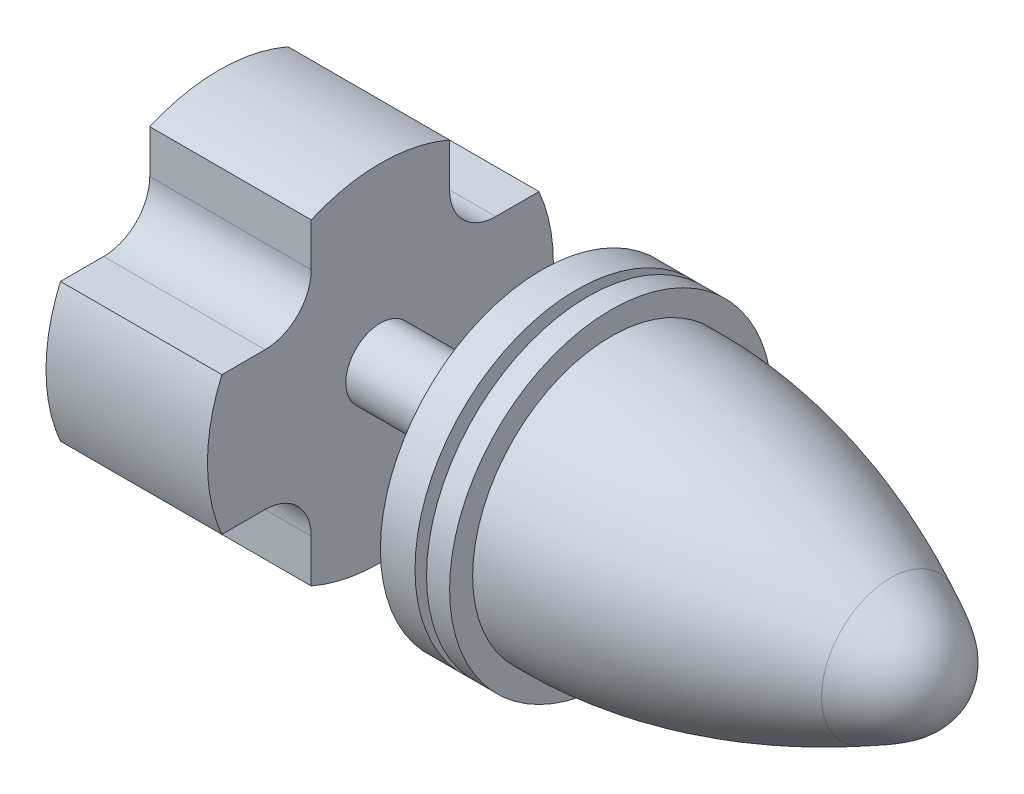
ISO-10303-21;
HEADER;
FILE_DESCRIPTION(('STEP AP214'),'2;1');
FILE_NAME('part.step','',(''),(''),'','','');
FILE_SCHEMA(('AUTOMOTIVE_DESIGN { 1 0 10303 214 1 1 1 1 }'));
ENDSEC;
DATA;
#1=APPLICATION_CONTEXT('core data for automotive mechanical design processes');
#2=APPLICATION_PROTOCOL_DEFINITION('international standard','automotive_design',2000,#1);
#3=PRODUCT_CONTEXT('',#1,'mechanical');
#4=PRODUCT('Part','Part','',(#3));
#5=PRODUCT_RELATED_PRODUCT_CATEGORY('part','',(#4));
#6=PRODUCT_DEFINITION_FORMATION('','',#4);
#7=PRODUCT_DEFINITION_CONTEXT('part definition',#1,'design');
#8=PRODUCT_DEFINITION('design','',#6,#7);
#9=PRODUCT_DEFINITION_SHAPE('','',#8);
#10=(LENGTH_UNIT() NAMED_UNIT(*) SI_UNIT(.MILLI.,.METRE.));
#11=(NAMED_UNIT(*) PLANE_ANGLE_UNIT() SI_UNIT($,.RADIAN.));
#12=(NAMED_UNIT(*) SI_UNIT($,.STERADIAN.) SOLID_ANGLE_UNIT());
#13=UNCERTAINTY_MEASURE_WITH_UNIT(LENGTH_MEASURE(1.E-05),#10,'distance_accuracy_value','');
#14=(GEOMETRIC_REPRESENTATION_CONTEXT(3) GLOBAL_UNCERTAINTY_ASSIGNED_CONTEXT((#13)) GLOBAL_UNIT_ASSIGNED_CONTEXT((#10,
#11,#12)) REPRESENTATION_CONTEXT('',''));
#15=CARTESIAN_POINT('',(0.,0.,0.));
#16=DIRECTION('',(0.,0.,1.));
#17=DIRECTION('',(1.,0.,0.));
#18=AXIS2_PLACEMENT_3D('',#15,#16,#17);
#19=CARTESIAN_POINT('',(0.,0.,0.));
#20=DIRECTION('',(-1.,0.,0.));
#21=DIRECTION('',(0.,0.,1.));
#22=AXIS2_PLACEMENT_3D('',#19,#20,#21);
#23=CYLINDRICAL_SURFACE('',#22,7.5);
#24=DIRECTION('',(-1.,0.,0.));
#25=VECTOR('',#24,1.);
#26=CARTESIAN_POINT('',(43.6678239931224,-2.99999999999993,-6.87386354243379));
#27=LINE('',#26,#25);
#28=CARTESIAN_POINT('',(40.6678239931224,-2.99999999999993,-6.87386354243379));
#29=VERTEX_POINT('',#28);
#30=CARTESIAN_POINT('',(33.6678239931224,-2.99999999999993,-6.87386354243379));
#31=VERTEX_POINT('',#30);
#32=EDGE_CURVE('E174',#29,#31,#27,.T.);
#33=ORIENTED_EDGE('',*,*,#32,.T.);
#34=CARTESIAN_POINT('',(33.6678239931224,0.,0.));
#35=DIRECTION('',(-1.,0.,0.));
#36=DIRECTION('',(0.,0.,1.));
#37=AXIS2_PLACEMENT_3D('',#34,#35,#36);
#38=CIRCLE('',#37,7.5);
#39=CARTESIAN_POINT('',(33.6678239931224,3.,-6.87386354243376));
#40=VERTEX_POINT('',#39);
#41=EDGE_CURVE('E318',#40,#31,#38,.T.);
#42=ORIENTED_EDGE('',*,*,#41,.F.);
#43=DIRECTION('',(-1.,0.,0.));
#44=VECTOR('',#43,1.);
#45=CARTESIAN_POINT('',(43.6678239931224,3.,-6.87386354243376));
#46=LINE('',#45,#44);
#47=CARTESIAN_POINT('',(40.6678239931224,3.,-6.87386354243376));
#48=VERTEX_POINT('',#47);
#49=EDGE_CURVE('E221',#48,#40,#46,.T.);
#50=ORIENTED_EDGE('',*,*,#49,.F.);
#51=CARTESIAN_POINT('',(40.6678239931224,0.,0.));
#52=DIRECTION('',(-1.,0.,0.));
#53=DIRECTION('',(0.,0.,1.));
#54=AXIS2_PLACEMENT_3D('',#51,#52,#53);
#55=CIRCLE('',#54,7.5);
#56=EDGE_CURVE('E320',#48,#29,#55,.T.);
#57=ORIENTED_EDGE('',*,*,#56,.T.);
#58=EDGE_LOOP('',(#33,#42,#50,#57));
#59=FACE_BOUND('',#58,.T.);
#60=ADVANCED_FACE('F33',(#59),#23,.T.);
#61=CARTESIAN_POINT('',(33.6678239931224,-6.87386354243373,-3.00000000000007));
#62=VERTEX_POINT('',#61);
#63=CARTESIAN_POINT('',(33.6678239931224,-6.87386354243378,2.99999999999995));
#64=VERTEX_POINT('',#63);
#65=EDGE_CURVE('E326',#62,#64,#38,.T.);
#66=ORIENTED_EDGE('',*,*,#65,.F.);
#67=DIRECTION('',(-1.,0.,0.));
#68=VECTOR('',#67,1.);
#69=CARTESIAN_POINT('',(43.6678239931224,-6.87386354243373,-3.00000000000007));
#70=LINE('',#69,#68);
#71=CARTESIAN_POINT('',(40.6678239931224,-6.87386354243373,-3.00000000000007));
#72=VERTEX_POINT('',#71);
#73=EDGE_CURVE('E162',#72,#62,#70,.T.);
#74=ORIENTED_EDGE('',*,*,#73,.F.);
#75=CARTESIAN_POINT('',(40.6678239931224,-6.87386354243378,2.99999999999995));
#76=VERTEX_POINT('',#75);
#77=EDGE_CURVE('E337',#72,#76,#55,.T.);
#78=ORIENTED_EDGE('',*,*,#77,.T.);
#79=DIRECTION('',(-1.,0.,0.));
#80=VECTOR('',#79,1.);
#81=CARTESIAN_POINT('',(43.6678239931224,-6.87386354243378,2.99999999999995));
#82=LINE('',#81,#80);
#83=EDGE_CURVE('E189',#76,#64,#82,.T.);
#84=ORIENTED_EDGE('',*,*,#83,.T.);
#85=EDGE_LOOP('',(#66,#74,#78,#84));
#86=FACE_BOUND('',#85,.T.);
#87=ADVANCED_FACE('F309',(#86),#23,.T.);
#88=CARTESIAN_POINT('',(33.6678239931224,-3.00000000000005,6.87386354243374));
#89=VERTEX_POINT('',#88);
#90=CARTESIAN_POINT('',(33.6678239931224,2.99999999999998,6.87386354243377));
#91=VERTEX_POINT('',#90);
#92=EDGE_CURVE('E332',#89,#91,#38,.T.);
#93=ORIENTED_EDGE('',*,*,#92,.F.);
#94=DIRECTION('',(-1.,0.,0.));
#95=VECTOR('',#94,1.);
#96=CARTESIAN_POINT('',(43.6678239931224,-3.00000000000005,6.87386354243374));
#97=LINE('',#96,#95);
#98=CARTESIAN_POINT('',(40.6678239931224,-3.00000000000005,6.87386354243374));
#99=VERTEX_POINT('',#98);
#100=EDGE_CURVE('E186',#99,#89,#97,.T.);
#101=ORIENTED_EDGE('',*,*,#100,.F.);
#102=CARTESIAN_POINT('',(40.6678239931224,2.99999999999998,6.87386354243377));
#103=VERTEX_POINT('',#102);
#104=EDGE_CURVE('E339',#99,#103,#55,.T.);
#105=ORIENTED_EDGE('',*,*,#104,.T.);
#106=DIRECTION('',(-1.,0.,0.));
#107=VECTOR('',#106,1.);
#108=CARTESIAN_POINT('',(43.6678239931224,2.99999999999998,6.87386354243377));
#109=LINE('',#108,#107);
#110=EDGE_CURVE('E206',#103,#91,#109,.T.);
#111=ORIENTED_EDGE('',*,*,#110,.T.);
#112=EDGE_LOOP('',(#93,#101,#105,#111));
#113=FACE_BOUND('',#112,.T.);
#114=ADVANCED_FACE('F293',(#113),#23,.T.);
#115=CARTESIAN_POINT('',(38.6678239931224,0.,0.));
#116=DIRECTION('',(1.,0.,0.));
#117=DIRECTION('',(0.,0.,-1.));
#118=AXIS2_PLACEMENT_3D('',#115,#116,#117);
#119=PLANE('',#118);
#120=CARTESIAN_POINT('',(38.6678239931224,0.,0.));
#121=DIRECTION('',(-1.,0.,0.));
#122=DIRECTION('',(0.,0.,1.));
#123=AXIS2_PLACEMENT_3D('',#120,#121,#122);
#124=CIRCLE('',#123,1.585);
#125=CARTESIAN_POINT('',(38.6678239931224,0.,1.585));
#126=VERTEX_POINT('',#125);
#127=EDGE_CURVE('E469',#126,#126,#124,.T.);
#128=ORIENTED_EDGE('',*,*,#127,.T.);
#129=EDGE_LOOP('',(#128));
#130=FACE_BOUND('',#129,.T.);
#131=ADVANCED_FACE('F35',(#130),#119,.F.);
#132=CARTESIAN_POINT('',(0.,0.,0.));
#133=DIRECTION('',(-1.,0.,0.));
#134=DIRECTION('',(0.,0.,1.));
#135=AXIS2_PLACEMENT_3D('',#132,#133,#134);
#136=CYLINDRICAL_SURFACE('',#135,1.585);
#137=ORIENTED_EDGE('',*,*,#127,.F.);
#138=EDGE_LOOP('',(#137));
#139=FACE_BOUND('',#138,.T.);
#140=CARTESIAN_POINT('',(36.6678239931224,0.,0.));
#141=DIRECTION('',(-1.,0.,0.));
#142=DIRECTION('',(0.,0.,1.));
#143=AXIS2_PLACEMENT_3D('',#140,#141,#142);
#144=CIRCLE('',#143,1.585);
#145=CARTESIAN_POINT('',(36.6678239931224,0.,1.585));
#146=VERTEX_POINT('',#145);
#147=EDGE_CURVE('E330',#146,#146,#144,.T.);
#148=ORIENTED_EDGE('',*,*,#147,.T.);
#149=EDGE_LOOP('',(#148));
#150=FACE_BOUND('',#149,.T.);
#151=ADVANCED_FACE('F298',(#139,#150),#136,.F.);
#152=CARTESIAN_POINT('',(33.6678239931224,0.,0.));
#153=DIRECTION('',(-1.,0.,0.));
#154=DIRECTION('',(0.,0.,1.));
#155=AXIS2_PLACEMENT_3D('',#152,#153,#154);
#156=CONICAL_SURFACE('',#155,4.585,0.785398163397448);
#157=ORIENTED_EDGE('',*,*,#147,.F.);
#158=EDGE_LOOP('',(#157));
#159=FACE_BOUND('',#158,.T.);
#160=CARTESIAN_POINT('',(33.6678239931224,0.,0.));
#161=DIRECTION('',(-1.,0.,0.));
#162=DIRECTION('',(0.,0.,1.));
#163=AXIS2_PLACEMENT_3D('',#160,#161,#162);
#164=CIRCLE('',#163,4.585);
#165=CARTESIAN_POINT('',(33.6678239931224,0.,4.585));
#166=VERTEX_POINT('',#165);
#167=EDGE_CURVE('E325',#166,#166,#164,.T.);
#168=ORIENTED_EDGE('',*,*,#167,.T.);
#169=EDGE_LOOP('',(#168));
#170=FACE_BOUND('',#169,.T.);
#171=ADVANCED_FACE('F296',(#159,#170),#156,.F.);
#172=CARTESIAN_POINT('',(33.6678239931224,4.585,0.));
#173=DIRECTION('',(1.,0.,0.));
#174=DIRECTION('',(0.,0.,-1.));
#175=AXIS2_PLACEMENT_3D('',#172,#173,#174);
#176=PLANE('',#175);
#177=CARTESIAN_POINT('',(33.6678239931224,-4.99999999999995,-5.00000000000005));
#178=DIRECTION('',(-1.,0.,0.));
#179=DIRECTION('',(0.,0.,1.));
#180=AXIS2_PLACEMENT_3D('',#177,#178,#179);
#181=CIRCLE('',#180,2.);
#182=CARTESIAN_POINT('',(33.6678239931224,-4.99999999999998,-3.00000000000005));
#183=VERTEX_POINT('',#182);
#184=CARTESIAN_POINT('',(33.6678239931224,-2.99999999999995,-5.00000000000005));
#185=VERTEX_POINT('',#184);
#186=EDGE_CURVE('E151',#183,#185,#181,.T.);
#187=ORIENTED_EDGE('',*,*,#186,.F.);
#188=DIRECTION('',(0.,1.,0.));
#189=VECTOR('',#188,1.);
#190=CARTESIAN_POINT('',(33.6678239931224,0.,-3.));
#191=LINE('',#190,#189);
#192=EDGE_CURVE('E159',#62,#183,#191,.T.);
#193=ORIENTED_EDGE('',*,*,#192,.F.);
#194=ORIENTED_EDGE('',*,*,#65,.T.);
#195=DIRECTION('',(0.,1.,0.));
#196=VECTOR('',#195,1.);
#197=CARTESIAN_POINT('',(33.6678239931224,0.,3.));
#198=LINE('',#197,#196);
#199=CARTESIAN_POINT('',(33.6678239931224,-5.00000000000004,2.99999999999997));
#200=VERTEX_POINT('',#199);
#201=EDGE_CURVE('E182',#64,#200,#198,.T.);
#202=ORIENTED_EDGE('',*,*,#201,.T.);
#203=CARTESIAN_POINT('',(33.6678239931224,-5.00000000000003,4.99999999999997));
#204=DIRECTION('',(-1.,0.,0.));
#205=DIRECTION('',(0.,0.,1.));
#206=AXIS2_PLACEMENT_3D('',#203,#204,#205);
#207=CIRCLE('',#206,2.);
#208=CARTESIAN_POINT('',(33.6678239931224,-3.00000000000004,4.99999999999999));
#209=VERTEX_POINT('',#208);
#210=EDGE_CURVE('E180',#209,#200,#207,.T.);
#211=ORIENTED_EDGE('',*,*,#210,.F.);
#212=DIRECTION('',(0.,0.,-1.));
#213=VECTOR('',#212,1.);
#214=CARTESIAN_POINT('',(33.6678239931224,-3.,0.));
#215=LINE('',#214,#213);
#216=EDGE_CURVE('E173',#89,#209,#215,.T.);
#217=ORIENTED_EDGE('',*,*,#216,.F.);
#218=ORIENTED_EDGE('',*,*,#92,.T.);
#219=DIRECTION('',(0.,0.,-1.));
#220=VECTOR('',#219,1.);
#221=CARTESIAN_POINT('',(33.6678239931224,3.,0.));
#222=LINE('',#221,#220);
#223=CARTESIAN_POINT('',(33.6678239931224,2.99999999999998,5.00000000000002));
#224=VERTEX_POINT('',#223);
#225=EDGE_CURVE('E199',#91,#224,#222,.T.);
#226=ORIENTED_EDGE('',*,*,#225,.T.);
#227=CARTESIAN_POINT('',(33.6678239931224,4.99999999999998,5.00000000000002));
#228=DIRECTION('',(-1.,0.,0.));
#229=DIRECTION('',(0.,0.,1.));
#230=AXIS2_PLACEMENT_3D('',#227,#228,#229);
#231=CIRCLE('',#230,2.);
#232=CARTESIAN_POINT('',(33.6678239931224,5.,3.00000000000002));
#233=VERTEX_POINT('',#232);
#234=EDGE_CURVE('E196',#233,#224,#231,.T.);
#235=ORIENTED_EDGE('',*,*,#234,.F.);
#236=DIRECTION('',(0.,-1.,0.));
#237=VECTOR('',#236,1.);
#238=CARTESIAN_POINT('',(33.6678239931224,0.,3.));
#239=LINE('',#238,#237);
#240=CARTESIAN_POINT('',(33.6678239931224,6.87386354243375,3.00000000000002));
#241=VERTEX_POINT('',#240);
#242=EDGE_CURVE('E188',#241,#233,#239,.T.);
#243=ORIENTED_EDGE('',*,*,#242,.F.);
#244=CARTESIAN_POINT('',(33.6678239931224,6.87386354243376,-3.));
#245=VERTEX_POINT('',#244);
#246=EDGE_CURVE('E328',#241,#245,#38,.T.);
#247=ORIENTED_EDGE('',*,*,#246,.T.);
#248=DIRECTION('',(0.,-1.,0.));
#249=VECTOR('',#248,1.);
#250=CARTESIAN_POINT('',(33.6678239931224,0.,-3.));
#251=LINE('',#250,#249);
#252=CARTESIAN_POINT('',(33.6678239931224,5.00000000000002,-3.));
#253=VERTEX_POINT('',#252);
#254=EDGE_CURVE('E217',#245,#253,#251,.T.);
#255=ORIENTED_EDGE('',*,*,#254,.T.);
#256=CARTESIAN_POINT('',(33.6678239931224,5.,-5.));
#257=DIRECTION('',(-1.,0.,0.));
#258=DIRECTION('',(0.,0.,1.));
#259=AXIS2_PLACEMENT_3D('',#256,#257,#258);
#260=CIRCLE('',#259,2.);
#261=CARTESIAN_POINT('',(33.6678239931224,3.,-5.00000000000002));
#262=VERTEX_POINT('',#261);
#263=EDGE_CURVE('E214',#262,#253,#260,.T.);
#264=ORIENTED_EDGE('',*,*,#263,.F.);
#265=DIRECTION('',(0.,0.,1.));
#266=VECTOR('',#265,1.);
#267=CARTESIAN_POINT('',(33.6678239931224,3.,0.));
#268=LINE('',#267,#266);
#269=EDGE_CURVE('E205',#40,#262,#268,.T.);
#270=ORIENTED_EDGE('',*,*,#269,.F.);
#271=ORIENTED_EDGE('',*,*,#41,.T.);
#272=DIRECTION('',(0.,0.,1.));
#273=VECTOR('',#272,1.);
#274=CARTESIAN_POINT('',(33.6678239931224,-3.,0.));
#275=LINE('',#274,#273);
#276=EDGE_CURVE('E156',#31,#185,#275,.T.);
#277=ORIENTED_EDGE('',*,*,#276,.T.);
#278=EDGE_LOOP('',(#187,#193,#194,#202,#211,#217,#218,#226,#235,#243,#247,#255,#264,#270,#271,#277));
#279=FACE_BOUND('',#278,.T.);
#280=ORIENTED_EDGE('',*,*,#167,.F.);
#281=EDGE_LOOP('',(#280));
#282=FACE_BOUND('',#281,.T.);
#283=ADVANCED_FACE('F166',(#279,#282),#176,.F.);
#284=ORIENTED_EDGE('',*,*,#246,.F.);
#285=DIRECTION('',(-1.,0.,0.));
#286=VECTOR('',#285,1.);
#287=CARTESIAN_POINT('',(43.6678239931224,6.87386354243375,3.00000000000002));
#288=LINE('',#287,#286);
#289=CARTESIAN_POINT('',(40.6678239931224,6.87386354243375,3.00000000000002));
#290=VERTEX_POINT('',#289);
#291=EDGE_CURVE('E203',#290,#241,#288,.T.);
#292=ORIENTED_EDGE('',*,*,#291,.F.);
#293=CARTESIAN_POINT('',(40.6678239931224,6.87386354243376,-3.));
#294=VERTEX_POINT('',#293);
#295=EDGE_CURVE('E338',#290,#294,#55,.T.);
#296=ORIENTED_EDGE('',*,*,#295,.T.);
#297=DIRECTION('',(-1.,0.,0.));
#298=VECTOR('',#297,1.);
#299=CARTESIAN_POINT('',(43.6678239931224,6.87386354243376,-3.));
#300=LINE('',#299,#298);
#301=EDGE_CURVE('E224',#294,#245,#300,.T.);
#302=ORIENTED_EDGE('',*,*,#301,.T.);
#303=EDGE_LOOP('',(#284,#292,#296,#302));
#304=FACE_BOUND('',#303,.T.);
#305=ADVANCED_FACE('F288',(#304),#23,.T.);
#306=CARTESIAN_POINT('',(40.6678239931224,7.5,0.));
#307=DIRECTION('',(-1.,0.,0.));
#308=DIRECTION('',(0.,0.,1.));
#309=AXIS2_PLACEMENT_3D('',#306,#307,#308);
#310=PLANE('',#309);
#311=ORIENTED_EDGE('',*,*,#77,.F.);
#312=DIRECTION('',(0.,1.,0.));
#313=VECTOR('',#312,1.);
#314=CARTESIAN_POINT('',(40.6678239931224,7.50000000000003,-2.99999999999992));
#315=LINE('',#314,#313);
#316=CARTESIAN_POINT('',(40.6678239931224,-4.99999999999998,-3.00000000000005));
#317=VERTEX_POINT('',#316);
#318=EDGE_CURVE('E11',#72,#317,#315,.T.);
#319=ORIENTED_EDGE('',*,*,#318,.T.);
#320=CARTESIAN_POINT('',(40.6678239931224,-4.99999999999995,-5.00000000000005));
#321=DIRECTION('',(-1.,0.,0.));
#322=DIRECTION('',(0.,0.,1.));
#323=AXIS2_PLACEMENT_3D('',#320,#321,#322);
#324=CIRCLE('',#323,2.);
#325=CARTESIAN_POINT('',(40.6678239931224,-2.99999999999995,-5.00000000000005));
#326=VERTEX_POINT('',#325);
#327=EDGE_CURVE('E154',#317,#326,#324,.T.);
#328=ORIENTED_EDGE('',*,*,#327,.T.);
#329=DIRECTION('',(0.,0.,1.));
#330=VECTOR('',#329,1.);
#331=CARTESIAN_POINT('',(40.6678239931224,-3.,-1.0701075442432E-13));
#332=LINE('',#331,#330);
#333=EDGE_CURVE('E41',#29,#326,#332,.T.);
#334=ORIENTED_EDGE('',*,*,#333,.F.);
#335=ORIENTED_EDGE('',*,*,#56,.F.);
#336=DIRECTION('',(0.,0.,1.));
#337=VECTOR('',#336,1.);
#338=CARTESIAN_POINT('',(40.6678239931224,3.,0.));
#339=LINE('',#338,#337);
#340=CARTESIAN_POINT('',(40.6678239931224,3.,-5.00000000000002));
#341=VERTEX_POINT('',#340);
#342=EDGE_CURVE('E412',#48,#341,#339,.T.);
#343=ORIENTED_EDGE('',*,*,#342,.T.);
#344=CARTESIAN_POINT('',(40.6678239931224,5.,-5.));
#345=DIRECTION('',(-1.,0.,0.));
#346=DIRECTION('',(0.,0.,1.));
#347=AXIS2_PLACEMENT_3D('',#344,#345,#346);
#348=CIRCLE('',#347,2.);
#349=CARTESIAN_POINT('',(40.6678239931224,5.,-3.));
#350=VERTEX_POINT('',#349);
#351=EDGE_CURVE('E462',#341,#350,#348,.T.);
#352=ORIENTED_EDGE('',*,*,#351,.T.);
#353=DIRECTION('',(0.,-1.,0.));
#354=VECTOR('',#353,1.);
#355=CARTESIAN_POINT('',(40.6678239931224,7.5,-3.));
#356=LINE('',#355,#354);
#357=EDGE_CURVE('E467',#294,#350,#356,.T.);
#358=ORIENTED_EDGE('',*,*,#357,.F.);
#359=ORIENTED_EDGE('',*,*,#295,.F.);
#360=DIRECTION('',(0.,-1.,0.));
#361=VECTOR('',#360,1.);
#362=CARTESIAN_POINT('',(40.6678239931224,7.49999999999999,3.00000000000003));
#363=LINE('',#362,#361);
#364=CARTESIAN_POINT('',(40.6678239931224,5.,3.00000000000002));
#365=VERTEX_POINT('',#364);
#366=EDGE_CURVE('E408',#290,#365,#363,.T.);
#367=ORIENTED_EDGE('',*,*,#366,.T.);
#368=CARTESIAN_POINT('',(40.6678239931224,4.99999999999998,5.00000000000002));
#369=DIRECTION('',(-1.,0.,0.));
#370=DIRECTION('',(0.,0.,1.));
#371=AXIS2_PLACEMENT_3D('',#368,#369,#370);
#372=CIRCLE('',#371,2.);
#373=CARTESIAN_POINT('',(40.6678239931224,2.99999999999998,5.00000000000002));
#374=VERTEX_POINT('',#373);
#375=EDGE_CURVE('E407',#365,#374,#372,.T.);
#376=ORIENTED_EDGE('',*,*,#375,.T.);
#377=DIRECTION('',(0.,0.,-1.));
#378=VECTOR('',#377,1.);
#379=CARTESIAN_POINT('',(40.6678239931224,3.,0.));
#380=LINE('',#379,#378);
#381=EDGE_CURVE('E403',#103,#374,#380,.T.);
#382=ORIENTED_EDGE('',*,*,#381,.F.);
#383=ORIENTED_EDGE('',*,*,#104,.F.);
#384=DIRECTION('',(0.,0.,-1.));
#385=VECTOR('',#384,1.);
#386=CARTESIAN_POINT('',(40.6678239931224,-3.,0.));
#387=LINE('',#386,#385);
#388=CARTESIAN_POINT('',(40.6678239931224,-3.00000000000004,4.99999999999999));
#389=VERTEX_POINT('',#388);
#390=EDGE_CURVE('E420',#99,#389,#387,.T.);
#391=ORIENTED_EDGE('',*,*,#390,.T.);
#392=CARTESIAN_POINT('',(40.6678239931224,-5.00000000000003,4.99999999999997));
#393=DIRECTION('',(-1.,0.,0.));
#394=DIRECTION('',(0.,0.,1.));
#395=AXIS2_PLACEMENT_3D('',#392,#393,#394);
#396=CIRCLE('',#395,2.);
#397=CARTESIAN_POINT('',(40.6678239931224,-5.00000000000004,2.99999999999997));
#398=VERTEX_POINT('',#397);
#399=EDGE_CURVE('E410',#389,#398,#396,.T.);
#400=ORIENTED_EDGE('',*,*,#399,.T.);
#401=DIRECTION('',(0.,1.,0.));
#402=VECTOR('',#401,1.);
#403=CARTESIAN_POINT('',(40.6678239931224,7.49999999999998,3.00000000000005));
#404=LINE('',#403,#402);
#405=EDGE_CURVE('E418',#76,#398,#404,.T.);
#406=ORIENTED_EDGE('',*,*,#405,.F.);
#407=EDGE_LOOP('',(#311,#319,#328,#334,#335,#343,#352,#358,#359,#367,#376,#382,#383,#391,#400,#406));
#408=FACE_BOUND('',#407,.T.);
#409=CARTESIAN_POINT('',(40.6678239931224,0.,0.));
#410=DIRECTION('',(-1.,0.,0.));
#411=DIRECTION('',(0.,0.,1.));
#412=AXIS2_PLACEMENT_3D('',#409,#410,#411);
#413=CIRCLE('',#412,1.5);
#414=CARTESIAN_POINT('',(40.6678239931224,0.,1.5));
#415=VERTEX_POINT('',#414);
#416=EDGE_CURVE('E341',#415,#415,#413,.T.);
#417=ORIENTED_EDGE('',*,*,#416,.T.);
#418=EDGE_LOOP('',(#417));
#419=FACE_BOUND('',#418,.T.);
#420=ADVANCED_FACE('F284',(#408,#419),#310,.F.);
#421=CARTESIAN_POINT('',(0.,0.,0.));
#422=DIRECTION('',(-1.,0.,0.));
#423=DIRECTION('',(0.,0.,1.));
#424=AXIS2_PLACEMENT_3D('',#421,#422,#423);
#425=CYLINDRICAL_SURFACE('',#424,1.5);
#426=ORIENTED_EDGE('',*,*,#416,.F.);
#427=EDGE_LOOP('',(#426));
#428=FACE_BOUND('',#427,.T.);
#429=CARTESIAN_POINT('',(47.6678239931224,0.,0.));
#430=DIRECTION('',(-1.,0.,0.));
#431=DIRECTION('',(0.,0.,1.));
#432=AXIS2_PLACEMENT_3D('',#429,#430,#431);
#433=CIRCLE('',#432,1.5);
#434=CARTESIAN_POINT('',(47.6678239931224,0.,1.5));
#435=VERTEX_POINT('',#434);
#436=EDGE_CURVE('E346',#435,#435,#433,.T.);
#437=ORIENTED_EDGE('',*,*,#436,.T.);
#438=EDGE_LOOP('',(#437));
#439=FACE_BOUND('',#438,.T.);
#440=ADVANCED_FACE('F280',(#428,#439),#425,.T.);
#441=CARTESIAN_POINT('',(47.6678239931224,1.5,0.));
#442=DIRECTION('',(1.,0.,0.));
#443=DIRECTION('',(0.,0.,-1.));
#444=AXIS2_PLACEMENT_3D('',#441,#442,#443);
#445=PLANE('',#444);
#446=ORIENTED_EDGE('',*,*,#436,.F.);
#447=EDGE_LOOP('',(#446));
#448=FACE_BOUND('',#447,.T.);
#449=CARTESIAN_POINT('',(47.6678239931224,0.,0.));
#450=DIRECTION('',(-1.,0.,0.));
#451=DIRECTION('',(0.,0.,1.));
#452=AXIS2_PLACEMENT_3D('',#449,#450,#451);
#453=CIRCLE('',#452,7.);
#454=CARTESIAN_POINT('',(47.6678239931224,0.,7.));
#455=VERTEX_POINT('',#454);
#456=EDGE_CURVE('E350',#455,#455,#453,.T.);
#457=ORIENTED_EDGE('',*,*,#456,.T.);
#458=EDGE_LOOP('',(#457));
#459=FACE_BOUND('',#458,.T.);
#460=ADVANCED_FACE('F276',(#448,#459),#445,.F.);
#461=CARTESIAN_POINT('',(0.,0.,0.));
#462=DIRECTION('',(-1.,0.,0.));
#463=DIRECTION('',(0.,0.,1.));
#464=AXIS2_PLACEMENT_3D('',#461,#462,#463);
#465=CYLINDRICAL_SURFACE('',#464,7.);
#466=ORIENTED_EDGE('',*,*,#456,.F.);
#467=EDGE_LOOP('',(#466));
#468=FACE_BOUND('',#467,.T.);
#469=CARTESIAN_POINT('',(49.1678239931224,0.,0.));
#470=DIRECTION('',(-1.,0.,0.));
#471=DIRECTION('',(0.,0.,1.));
#472=AXIS2_PLACEMENT_3D('',#469,#470,#471);
#473=CIRCLE('',#472,7.);
#474=CARTESIAN_POINT('',(49.1678239931224,0.,7.));
#475=VERTEX_POINT('',#474);
#476=EDGE_CURVE('E355',#475,#475,#473,.T.);
#477=ORIENTED_EDGE('',*,*,#476,.T.);
#478=EDGE_LOOP('',(#477));
#479=FACE_BOUND('',#478,.T.);
#480=ADVANCED_FACE('F272',(#468,#479),#465,.T.);
#481=CARTESIAN_POINT('',(49.1678239931224,7.,0.));
#482=DIRECTION('',(-1.,0.,0.));
#483=DIRECTION('',(0.,0.,1.));
#484=AXIS2_PLACEMENT_3D('',#481,#482,#483);
#485=PLANE('',#484);
#486=ORIENTED_EDGE('',*,*,#476,.F.);
#487=EDGE_LOOP('',(#486));
#488=FACE_BOUND('',#487,.T.);
#489=CARTESIAN_POINT('',(49.1678239931224,0.,0.));
#490=DIRECTION('',(-1.,0.,0.));
#491=DIRECTION('',(0.,0.,1.));
#492=AXIS2_PLACEMENT_3D('',#489,#490,#491);
#493=CIRCLE('',#492,1.5);
#494=CARTESIAN_POINT('',(49.1678239931224,0.,1.5));
#495=VERTEX_POINT('',#494);
#496=EDGE_CURVE('E358',#495,#495,#493,.T.);
#497=ORIENTED_EDGE('',*,*,#496,.T.);
#498=EDGE_LOOP('',(#497));
#499=FACE_BOUND('',#498,.T.);
#500=ADVANCED_FACE('F268',(#488,#499),#485,.F.);
#501=CARTESIAN_POINT('',(0.,0.,0.));
#502=DIRECTION('',(-1.,0.,0.));
#503=DIRECTION('',(0.,0.,1.));
#504=AXIS2_PLACEMENT_3D('',#501,#502,#503);
#505=CYLINDRICAL_SURFACE('',#504,1.5);
#506=ORIENTED_EDGE('',*,*,#496,.F.);
#507=EDGE_LOOP('',(#506));
#508=FACE_BOUND('',#507,.T.);
#509=CARTESIAN_POINT('',(49.6678239931224,0.,0.));
#510=DIRECTION('',(-1.,0.,0.));
#511=DIRECTION('',(0.,0.,1.));
#512=AXIS2_PLACEMENT_3D('',#509,#510,#511);
#513=CIRCLE('',#512,1.5);
#514=CARTESIAN_POINT('',(49.6678239931224,0.,1.5));
#515=VERTEX_POINT('',#514);
#516=EDGE_CURVE('E361',#515,#515,#513,.T.);
#517=ORIENTED_EDGE('',*,*,#516,.T.);
#518=EDGE_LOOP('',(#517));
#519=FACE_BOUND('',#518,.T.);
#520=ADVANCED_FACE('F264',(#508,#519),#505,.T.);
#521=CARTESIAN_POINT('',(49.6678239931224,1.5,0.));
#522=DIRECTION('',(1.,0.,0.));
#523=DIRECTION('',(0.,0.,-1.));
#524=AXIS2_PLACEMENT_3D('',#521,#522,#523);
#525=PLANE('',#524);
#526=ORIENTED_EDGE('',*,*,#516,.F.);
#527=EDGE_LOOP('',(#526));
#528=FACE_BOUND('',#527,.T.);
#529=CARTESIAN_POINT('',(49.6678239931224,0.,0.));
#530=DIRECTION('',(-1.,0.,0.));
#531=DIRECTION('',(0.,0.,1.));
#532=AXIS2_PLACEMENT_3D('',#529,#530,#531);
#533=CIRCLE('',#532,7.);
#534=CARTESIAN_POINT('',(49.6678239931224,0.,7.));
#535=VERTEX_POINT('',#534);
#536=EDGE_CURVE('E364',#535,#535,#533,.T.);
#537=ORIENTED_EDGE('',*,*,#536,.T.);
#538=EDGE_LOOP('',(#537));
#539=FACE_BOUND('',#538,.T.);
#540=ADVANCED_FACE('F260',(#528,#539),#525,.F.);
#541=CARTESIAN_POINT('',(0.,0.,0.));
#542=DIRECTION('',(-1.,0.,0.));
#543=DIRECTION('',(0.,0.,1.));
#544=AXIS2_PLACEMENT_3D('',#541,#542,#543);
#545=CYLINDRICAL_SURFACE('',#544,7.);
#546=ORIENTED_EDGE('',*,*,#536,.F.);
#547=EDGE_LOOP('',(#546));
#548=FACE_BOUND('',#547,.T.);
#549=CARTESIAN_POINT('',(50.6678239931224,0.,0.));
#550=DIRECTION('',(-1.,0.,0.));
#551=DIRECTION('',(0.,0.,1.));
#552=AXIS2_PLACEMENT_3D('',#549,#550,#551);
#553=CIRCLE('',#552,7.);
#554=CARTESIAN_POINT('',(50.6678239931224,0.,7.));
#555=VERTEX_POINT('',#554);
#556=EDGE_CURVE('E367',#555,#555,#553,.T.);
#557=ORIENTED_EDGE('',*,*,#556,.T.);
#558=EDGE_LOOP('',(#557));
#559=FACE_BOUND('',#558,.T.);
#560=ADVANCED_FACE('F256',(#548,#559),#545,.T.);
#561=CARTESIAN_POINT('',(50.6678239931224,7.,0.));
#562=DIRECTION('',(-1.,0.,0.));
#563=DIRECTION('',(0.,0.,1.));
#564=AXIS2_PLACEMENT_3D('',#561,#562,#563);
#565=PLANE('',#564);
#566=ORIENTED_EDGE('',*,*,#556,.F.);
#567=EDGE_LOOP('',(#566));
#568=FACE_BOUND('',#567,.T.);
#569=CARTESIAN_POINT('',(50.6678239931224,0.,0.));
#570=DIRECTION('',(-1.,0.,0.));
#571=DIRECTION('',(0.,0.,1.));
#572=AXIS2_PLACEMENT_3D('',#569,#570,#571);
#573=CIRCLE('',#572,6.);
#574=CARTESIAN_POINT('',(50.6678239931224,0.,6.));
#575=VERTEX_POINT('',#574);
#576=EDGE_CURVE('E370',#575,#575,#573,.T.);
#577=ORIENTED_EDGE('',*,*,#576,.T.);
#578=EDGE_LOOP('',(#577));
#579=FACE_BOUND('',#578,.T.);
#580=ADVANCED_FACE('F252',(#568,#579),#565,.F.);
#581=CARTESIAN_POINT('',(62.781307834284,2.98432802333405,0.));
#582=CARTESIAN_POINT('',(58.9015409343251,4.91113009917091,0.));
#583=CARTESIAN_POINT('',(54.792010737939,6.08282470293356,0.));
#584=CARTESIAN_POINT('',(50.6678239931224,6.,0.));
#585=B_SPLINE_CURVE_WITH_KNOTS('',3,(#581,#582,#583,#584),.UNSPECIFIED.,.F.,.F.,(4,4),(0.,1.),.UNSPECIFIED.);
#586=CARTESIAN_POINT('',(0.,0.,0.));
#587=DIRECTION('',(-1.,0.,0.));
#588=AXIS1_PLACEMENT('',#586,#587);
#589=SURFACE_OF_REVOLUTION('',#585,#588);
#590=ORIENTED_EDGE('',*,*,#576,.F.);
#591=EDGE_LOOP('',(#590));
#592=FACE_BOUND('',#591,.T.);
#593=CARTESIAN_POINT('',(62.781307834284,0.,0.));
#594=DIRECTION('',(-1.,0.,0.));
#595=DIRECTION('',(0.,0.,1.));
#596=AXIS2_PLACEMENT_3D('',#593,#594,#595);
#597=CIRCLE('',#596,2.98432802333405);
#598=CARTESIAN_POINT('',(62.781307834284,0.,2.98432802333405));
#599=VERTEX_POINT('',#598);
#600=EDGE_CURVE('E223',#599,#599,#597,.T.);
#601=ORIENTED_EDGE('',*,*,#600,.T.);
#602=EDGE_LOOP('',(#601));
#603=FACE_BOUND('',#602,.T.);
#604=ADVANCED_FACE('F247',(#592,#603),#589,.T.);
#605=CARTESIAN_POINT('',(65.6678239931224,0.,0.));
#606=CARTESIAN_POINT('',(65.4739170318066,1.72759636803093,0.));
#607=CARTESIAN_POINT('',(64.2659483183906,2.24701352985806,0.));
#608=CARTESIAN_POINT('',(62.781307834284,2.98432802333405,0.));
#609=B_SPLINE_CURVE_WITH_KNOTS('',3,(#605,#606,#607,#608),.UNSPECIFIED.,.F.,.F.,(4,4),(0.,1.),.UNSPECIFIED.);
#610=CARTESIAN_POINT('',(0.,0.,0.));
#611=DIRECTION('',(-1.,0.,0.));
#612=AXIS1_PLACEMENT('',#610,#611);
#613=SURFACE_OF_REVOLUTION('',#609,#612);
#614=ORIENTED_EDGE('',*,*,#600,.F.);
#615=EDGE_LOOP('',(#614));
#616=FACE_BOUND('',#615,.T.);
#617=CARTESIAN_POINT('',(65.6678239931224,0.,0.));
#618=VERTEX_POINT('',#617);
#619=VERTEX_LOOP('',#618);
#620=FACE_BOUND('',#619,.T.);
#621=ADVANCED_FACE('F242',(#616,#620),#613,.T.);
#622=CARTESIAN_POINT('',(43.6678239931224,3.,0.));
#623=DIRECTION('',(0.,-1.,0.));
#624=DIRECTION('',(0.,0.,-1.));
#625=AXIS2_PLACEMENT_3D('',#622,#623,#624);
#626=PLANE('',#625);
#627=ORIENTED_EDGE('',*,*,#49,.T.);
#628=ORIENTED_EDGE('',*,*,#269,.T.);
#629=DIRECTION('',(-1.,0.,0.));
#630=VECTOR('',#629,1.);
#631=CARTESIAN_POINT('',(43.6678239931224,3.,-5.00000000000002));
#632=LINE('',#631,#630);
#633=EDGE_CURVE('E220',#341,#262,#632,.T.);
#634=ORIENTED_EDGE('',*,*,#633,.F.);
#635=ORIENTED_EDGE('',*,*,#342,.F.);
#636=EDGE_LOOP('',(#627,#628,#634,#635));
#637=FACE_BOUND('',#636,.T.);
#638=ADVANCED_FACE('F246',(#637),#626,.F.);
#639=CARTESIAN_POINT('',(43.6678239931224,0.,-3.));
#640=DIRECTION('',(0.,0.,-1.));
#641=DIRECTION('',(0.,1.,0.));
#642=AXIS2_PLACEMENT_3D('',#639,#640,#641);
#643=PLANE('',#642);
#644=ORIENTED_EDGE('',*,*,#357,.T.);
#645=DIRECTION('',(-1.,0.,0.));
#646=VECTOR('',#645,1.);
#647=CARTESIAN_POINT('',(43.6678239931224,5.00000000000002,-3.));
#648=LINE('',#647,#646);
#649=EDGE_CURVE('E227',#350,#253,#648,.T.);
#650=ORIENTED_EDGE('',*,*,#649,.T.);
#651=ORIENTED_EDGE('',*,*,#254,.F.);
#652=ORIENTED_EDGE('',*,*,#301,.F.);
#653=EDGE_LOOP('',(#644,#650,#651,#652));
#654=FACE_BOUND('',#653,.T.);
#655=ADVANCED_FACE('F453',(#654),#643,.T.);
#656=CARTESIAN_POINT('',(43.6678239931224,5.,-5.));
#657=DIRECTION('',(-1.,0.,0.));
#658=DIRECTION('',(0.,0.,1.));
#659=AXIS2_PLACEMENT_3D('',#656,#657,#658);
#660=CYLINDRICAL_SURFACE('',#659,2.);
#661=ORIENTED_EDGE('',*,*,#633,.T.);
#662=ORIENTED_EDGE('',*,*,#263,.T.);
#663=ORIENTED_EDGE('',*,*,#649,.F.);
#664=ORIENTED_EDGE('',*,*,#351,.F.);
#665=EDGE_LOOP('',(#661,#662,#663,#664));
#666=FACE_BOUND('',#665,.T.);
#667=ADVANCED_FACE('F451',(#666),#660,.F.);
#668=CARTESIAN_POINT('',(43.6678239931224,0.,3.));
#669=DIRECTION('',(0.,0.,-1.));
#670=DIRECTION('',(0.,1.,0.));
#671=AXIS2_PLACEMENT_3D('',#668,#669,#670);
#672=PLANE('',#671);
#673=ORIENTED_EDGE('',*,*,#291,.T.);
#674=ORIENTED_EDGE('',*,*,#242,.T.);
#675=DIRECTION('',(-1.,0.,0.));
#676=VECTOR('',#675,1.);
#677=CARTESIAN_POINT('',(43.6678239931224,5.,3.00000000000002));
#678=LINE('',#677,#676);
#679=EDGE_CURVE('E202',#365,#233,#678,.T.);
#680=ORIENTED_EDGE('',*,*,#679,.F.);
#681=ORIENTED_EDGE('',*,*,#366,.F.);
#682=EDGE_LOOP('',(#673,#674,#680,#681));
#683=FACE_BOUND('',#682,.T.);
#684=ADVANCED_FACE('F447',(#683),#672,.F.);
#685=CARTESIAN_POINT('',(43.6678239931224,3.,0.));
#686=DIRECTION('',(0.,1.,0.));
#687=DIRECTION('',(0.,0.,1.));
#688=AXIS2_PLACEMENT_3D('',#685,#686,#687);
#689=PLANE('',#688);
#690=ORIENTED_EDGE('',*,*,#381,.T.);
#691=DIRECTION('',(-1.,0.,0.));
#692=VECTOR('',#691,1.);
#693=CARTESIAN_POINT('',(43.6678239931224,2.99999999999998,5.00000000000002));
#694=LINE('',#693,#692);
#695=EDGE_CURVE('E209',#374,#224,#694,.T.);
#696=ORIENTED_EDGE('',*,*,#695,.T.);
#697=ORIENTED_EDGE('',*,*,#225,.F.);
#698=ORIENTED_EDGE('',*,*,#110,.F.);
#699=EDGE_LOOP('',(#690,#696,#697,#698));
#700=FACE_BOUND('',#699,.T.);
#701=ADVANCED_FACE('F402',(#700),#689,.T.);
#702=CARTESIAN_POINT('',(43.6678239931224,4.99999999999998,5.00000000000002));
#703=DIRECTION('',(-1.,0.,0.));
#704=DIRECTION('',(0.,0.,1.));
#705=AXIS2_PLACEMENT_3D('',#702,#703,#704);
#706=CYLINDRICAL_SURFACE('',#705,2.);
#707=ORIENTED_EDGE('',*,*,#679,.T.);
#708=ORIENTED_EDGE('',*,*,#234,.T.);
#709=ORIENTED_EDGE('',*,*,#695,.F.);
#710=ORIENTED_EDGE('',*,*,#375,.F.);
#711=EDGE_LOOP('',(#707,#708,#709,#710));
#712=FACE_BOUND('',#711,.T.);
#713=ADVANCED_FACE('F435',(#712),#706,.F.);
#714=CARTESIAN_POINT('',(43.6678239931224,-3.,0.));
#715=DIRECTION('',(0.,1.,0.));
#716=DIRECTION('',(0.,0.,1.));
#717=AXIS2_PLACEMENT_3D('',#714,#715,#716);
#718=PLANE('',#717);
#719=ORIENTED_EDGE('',*,*,#100,.T.);
#720=ORIENTED_EDGE('',*,*,#216,.T.);
#721=DIRECTION('',(-1.,0.,0.));
#722=VECTOR('',#721,1.);
#723=CARTESIAN_POINT('',(43.6678239931224,-3.00000000000004,4.99999999999999));
#724=LINE('',#723,#722);
#725=EDGE_CURVE('E185',#389,#209,#724,.T.);
#726=ORIENTED_EDGE('',*,*,#725,.F.);
#727=ORIENTED_EDGE('',*,*,#390,.F.);
#728=EDGE_LOOP('',(#719,#720,#726,#727));
#729=FACE_BOUND('',#728,.T.);
#730=ADVANCED_FACE('F433',(#729),#718,.F.);
#731=CARTESIAN_POINT('',(43.6678239931224,0.,3.));
#732=DIRECTION('',(0.,0.,1.));
#733=DIRECTION('',(0.,-1.,0.));
#734=AXIS2_PLACEMENT_3D('',#731,#732,#733);
#735=PLANE('',#734);
#736=ORIENTED_EDGE('',*,*,#405,.T.);
#737=DIRECTION('',(-1.,0.,0.));
#738=VECTOR('',#737,1.);
#739=CARTESIAN_POINT('',(43.6678239931224,-5.00000000000004,2.99999999999997));
#740=LINE('',#739,#738);
#741=EDGE_CURVE('E56',#398,#200,#740,.T.);
#742=ORIENTED_EDGE('',*,*,#741,.T.);
#743=ORIENTED_EDGE('',*,*,#201,.F.);
#744=ORIENTED_EDGE('',*,*,#83,.F.);
#745=EDGE_LOOP('',(#736,#742,#743,#744));
#746=FACE_BOUND('',#745,.T.);
#747=ADVANCED_FACE('F428',(#746),#735,.T.);
#748=CARTESIAN_POINT('',(43.6678239931224,-5.00000000000003,4.99999999999997));
#749=DIRECTION('',(-1.,0.,0.));
#750=DIRECTION('',(0.,0.,1.));
#751=AXIS2_PLACEMENT_3D('',#748,#749,#750);
#752=CYLINDRICAL_SURFACE('',#751,2.);
#753=ORIENTED_EDGE('',*,*,#725,.T.);
#754=ORIENTED_EDGE('',*,*,#210,.T.);
#755=ORIENTED_EDGE('',*,*,#741,.F.);
#756=ORIENTED_EDGE('',*,*,#399,.F.);
#757=EDGE_LOOP('',(#753,#754,#755,#756));
#758=FACE_BOUND('',#757,.T.);
#759=ADVANCED_FACE('F429',(#758),#752,.F.);
#760=CARTESIAN_POINT('',(43.6678239931224,0.,-3.));
#761=DIRECTION('',(0.,0.,1.));
#762=DIRECTION('',(0.,-1.,0.));
#763=AXIS2_PLACEMENT_3D('',#760,#761,#762);
#764=PLANE('',#763);
#765=ORIENTED_EDGE('',*,*,#73,.T.);
#766=ORIENTED_EDGE('',*,*,#192,.T.);
#767=DIRECTION('',(-1.,0.,0.));
#768=VECTOR('',#767,1.);
#769=CARTESIAN_POINT('',(43.6678239931224,-4.99999999999998,-3.00000000000005));
#770=LINE('',#769,#768);
#771=EDGE_CURVE('E147',#317,#183,#770,.T.);
#772=ORIENTED_EDGE('',*,*,#771,.F.);
#773=ORIENTED_EDGE('',*,*,#318,.F.);
#774=EDGE_LOOP('',(#765,#766,#772,#773));
#775=FACE_BOUND('',#774,.T.);
#776=ADVANCED_FACE('F160',(#775),#764,.F.);
#777=CARTESIAN_POINT('',(43.6678239931224,-3.,0.));
#778=DIRECTION('',(0.,-1.,0.));
#779=DIRECTION('',(0.,0.,-1.));
#780=AXIS2_PLACEMENT_3D('',#777,#778,#779);
#781=PLANE('',#780);
#782=ORIENTED_EDGE('',*,*,#333,.T.);
#783=DIRECTION('',(-1.,0.,0.));
#784=VECTOR('',#783,1.);
#785=CARTESIAN_POINT('',(43.6678239931224,-2.99999999999995,-5.00000000000005));
#786=LINE('',#785,#784);
#787=EDGE_CURVE('E48',#326,#185,#786,.T.);
#788=ORIENTED_EDGE('',*,*,#787,.T.);
#789=ORIENTED_EDGE('',*,*,#276,.F.);
#790=ORIENTED_EDGE('',*,*,#32,.F.);
#791=EDGE_LOOP('',(#782,#788,#789,#790));
#792=FACE_BOUND('',#791,.T.);
#793=ADVANCED_FACE('F422',(#792),#781,.T.);
#794=CARTESIAN_POINT('',(43.6678239931224,-4.99999999999995,-5.00000000000005));
#795=DIRECTION('',(-1.,0.,0.));
#796=DIRECTION('',(0.,0.,1.));
#797=AXIS2_PLACEMENT_3D('',#794,#795,#796);
#798=CYLINDRICAL_SURFACE('',#797,2.);
#799=ORIENTED_EDGE('',*,*,#771,.T.);
#800=ORIENTED_EDGE('',*,*,#186,.T.);
#801=ORIENTED_EDGE('',*,*,#787,.F.);
#802=ORIENTED_EDGE('',*,*,#327,.F.);
#803=EDGE_LOOP('',(#799,#800,#801,#802));
#804=FACE_BOUND('',#803,.T.);
#805=ADVANCED_FACE('F149',(#804),#798,.F.);
#806=CLOSED_SHELL('',(#60,#87,#114,#131,#151,#171,#283,#305,#420,#440,#460,#480,#500,#520,#540,
#560,#580,#604,#621,#638,#655,#667,#684,#701,#713,#730,#747,#759,#776,#793,#805));
#807=MANIFOLD_SOLID_BREP('B2',#806);
#808=ADVANCED_BREP_SHAPE_REPRESENTATION('',(#18,#807),#14);
#809=SHAPE_DEFINITION_REPRESENTATION(#9,#808);
ENDSEC;
END-ISO-10303-21;
